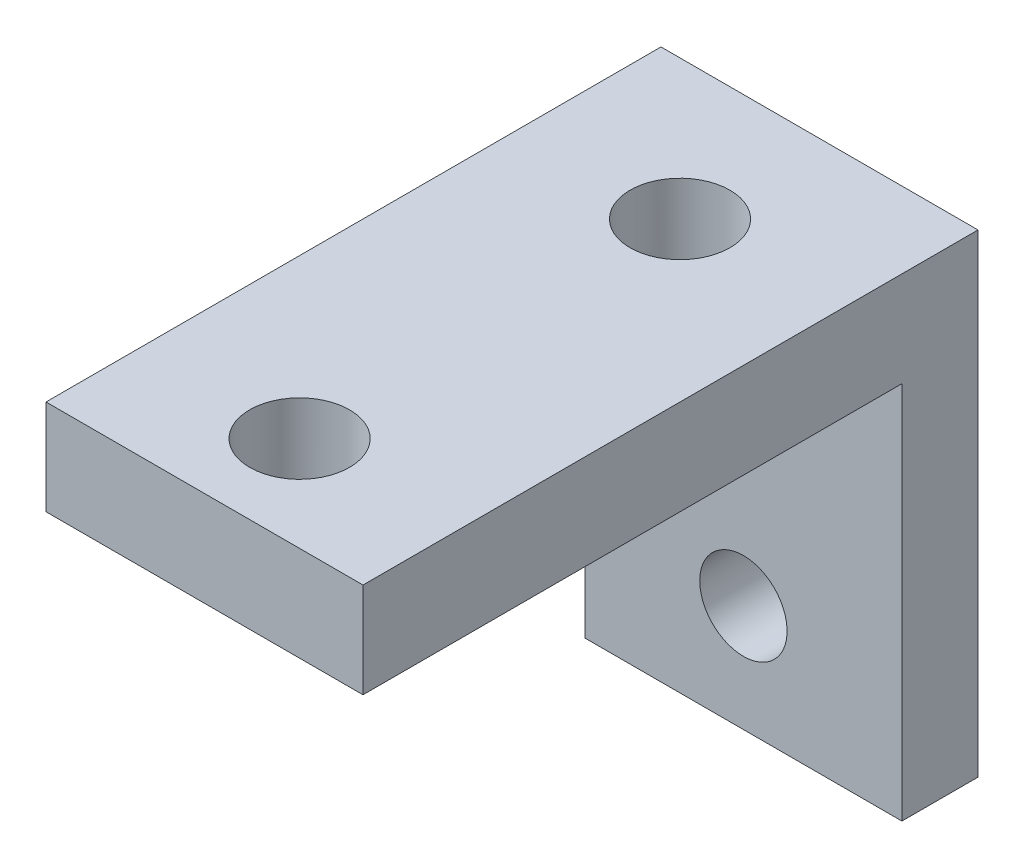
ISO-10303-21;
HEADER;
FILE_DESCRIPTION(('STEP AP214'),'2;1');
FILE_NAME('part.step','',(''),(''),'','','');
FILE_SCHEMA(('AUTOMOTIVE_DESIGN { 1 0 10303 214 1 1 1 1 }'));
ENDSEC;
DATA;
#1=APPLICATION_CONTEXT('core data for automotive mechanical design processes');
#2=APPLICATION_PROTOCOL_DEFINITION('international standard','automotive_design',2000,#1);
#3=PRODUCT_CONTEXT('',#1,'mechanical');
#4=PRODUCT('Part','Part','',(#3));
#5=PRODUCT_RELATED_PRODUCT_CATEGORY('part','',(#4));
#6=PRODUCT_DEFINITION_FORMATION('','',#4);
#7=PRODUCT_DEFINITION_CONTEXT('part definition',#1,'design');
#8=PRODUCT_DEFINITION('design','',#6,#7);
#9=PRODUCT_DEFINITION_SHAPE('','',#8);
#10=(LENGTH_UNIT() NAMED_UNIT(*) SI_UNIT(.MILLI.,.METRE.));
#11=(NAMED_UNIT(*) PLANE_ANGLE_UNIT() SI_UNIT($,.RADIAN.));
#12=(NAMED_UNIT(*) SI_UNIT($,.STERADIAN.) SOLID_ANGLE_UNIT());
#13=UNCERTAINTY_MEASURE_WITH_UNIT(LENGTH_MEASURE(1.E-05),#10,'distance_accuracy_value','');
#14=(GEOMETRIC_REPRESENTATION_CONTEXT(3) GLOBAL_UNCERTAINTY_ASSIGNED_CONTEXT((#13)) GLOBAL_UNIT_ASSIGNED_CONTEXT((#10,
#11,#12)) REPRESENTATION_CONTEXT('',''));
#15=CARTESIAN_POINT('',(0.,0.,0.));
#16=DIRECTION('',(0.,0.,1.));
#17=DIRECTION('',(1.,0.,0.));
#18=AXIS2_PLACEMENT_3D('',#15,#16,#17);
#19=CARTESIAN_POINT('',(0.,0.,3.048));
#20=DIRECTION('',(0.,0.,-1.));
#21=DIRECTION('',(-1.,0.,0.));
#22=AXIS2_PLACEMENT_3D('',#19,#20,#21);
#23=PLANE('',#22);
#24=CARTESIAN_POINT('',(0.,-5.203000064,3.048));
#25=DIRECTION('',(0.,0.,1.));
#26=DIRECTION('',(1.,0.,0.));
#27=AXIS2_PLACEMENT_3D('',#24,#25,#26);
#28=CIRCLE('',#27,1.75);
#29=CARTESIAN_POINT('',(-1.75,-5.203000064,3.048));
#30=VERTEX_POINT('',#29);
#31=EDGE_CURVE('E103',#30,#30,#28,.T.);
#32=ORIENTED_EDGE('',*,*,#31,.F.);
#33=EDGE_LOOP('',(#32));
#34=FACE_BOUND('',#33,.T.);
#35=DIRECTION('',(1.,0.,0.));
#36=VECTOR('',#35,1.);
#37=CARTESIAN_POINT('',(-6.35,5.683000064,3.048));
#38=LINE('',#37,#36);
#39=CARTESIAN_POINT('',(-6.35,5.683000064,3.048));
#40=VERTEX_POINT('',#39);
#41=CARTESIAN_POINT('',(6.35,5.683000064,3.048));
#42=VERTEX_POINT('',#41);
#43=EDGE_CURVE('E56',#40,#42,#38,.T.);
#44=ORIENTED_EDGE('',*,*,#43,.F.);
#45=DIRECTION('',(0.,-1.,0.));
#46=VECTOR('',#45,1.);
#47=CARTESIAN_POINT('',(-6.34999999999999,-9.493000064,3.048));
#48=LINE('',#47,#46);
#49=CARTESIAN_POINT('',(-6.34999999999999,-9.493000064,3.048));
#50=VERTEX_POINT('',#49);
#51=EDGE_CURVE('E149',#40,#50,#48,.T.);
#52=ORIENTED_EDGE('',*,*,#51,.T.);
#53=DIRECTION('',(1.,0.,0.));
#54=VECTOR('',#53,1.);
#55=CARTESIAN_POINT('',(-6.34999999999999,-9.493000064,3.048));
#56=LINE('',#55,#54);
#57=CARTESIAN_POINT('',(6.35,-9.493000064,3.048));
#58=VERTEX_POINT('',#57);
#59=EDGE_CURVE('E62',#50,#58,#56,.T.);
#60=ORIENTED_EDGE('',*,*,#59,.T.);
#61=DIRECTION('',(0.,1.,0.));
#62=VECTOR('',#61,1.);
#63=CARTESIAN_POINT('',(6.35,-9.493000064,3.048));
#64=LINE('',#63,#62);
#65=EDGE_CURVE('E91',#58,#42,#64,.T.);
#66=ORIENTED_EDGE('',*,*,#65,.T.);
#67=EDGE_LOOP('',(#44,#52,#60,#66));
#68=FACE_BOUND('',#67,.T.);
#69=ADVANCED_FACE('F39',(#34,#68),#23,.F.);
#70=CARTESIAN_POINT('',(0.,0.,0.));
#71=DIRECTION('',(0.,0.,-1.));
#72=DIRECTION('',(-1.,0.,0.));
#73=AXIS2_PLACEMENT_3D('',#70,#71,#72);
#74=PLANE('',#73);
#75=DIRECTION('',(0.,1.,0.));
#76=VECTOR('',#75,1.);
#77=CARTESIAN_POINT('',(6.35,-9.493000064,0.));
#78=LINE('',#77,#76);
#79=CARTESIAN_POINT('',(6.35,-9.493000064,0.));
#80=VERTEX_POINT('',#79);
#81=CARTESIAN_POINT('',(6.35,9.493000064,0.));
#82=VERTEX_POINT('',#81);
#83=EDGE_CURVE('E97',#80,#82,#78,.T.);
#84=ORIENTED_EDGE('',*,*,#83,.F.);
#85=DIRECTION('',(1.,0.,0.));
#86=VECTOR('',#85,1.);
#87=CARTESIAN_POINT('',(-6.34999999999999,-9.493000064,0.));
#88=LINE('',#87,#86);
#89=CARTESIAN_POINT('',(-6.34999999999999,-9.493000064,0.));
#90=VERTEX_POINT('',#89);
#91=EDGE_CURVE('E81',#90,#80,#88,.T.);
#92=ORIENTED_EDGE('',*,*,#91,.F.);
#93=DIRECTION('',(0.,-1.,0.));
#94=VECTOR('',#93,1.);
#95=CARTESIAN_POINT('',(-6.34999999999999,-9.493000064,0.));
#96=LINE('',#95,#94);
#97=CARTESIAN_POINT('',(-6.35,9.493000064,0.));
#98=VERTEX_POINT('',#97);
#99=EDGE_CURVE('E92',#98,#90,#96,.T.);
#100=ORIENTED_EDGE('',*,*,#99,.F.);
#101=DIRECTION('',(-1.,0.,0.));
#102=VECTOR('',#101,1.);
#103=CARTESIAN_POINT('',(-6.35,9.493000064,0.));
#104=LINE('',#103,#102);
#105=EDGE_CURVE('E102',#82,#98,#104,.T.);
#106=ORIENTED_EDGE('',*,*,#105,.F.);
#107=EDGE_LOOP('',(#84,#92,#100,#106));
#108=FACE_BOUND('',#107,.T.);
#109=CARTESIAN_POINT('',(0.,-5.203000064,0.));
#110=DIRECTION('',(0.,0.,1.));
#111=DIRECTION('',(1.,0.,0.));
#112=AXIS2_PLACEMENT_3D('',#109,#110,#111);
#113=CIRCLE('',#112,1.75);
#114=CARTESIAN_POINT('',(-1.75,-5.203000064,0.));
#115=VERTEX_POINT('',#114);
#116=EDGE_CURVE('E107',#115,#115,#113,.T.);
#117=ORIENTED_EDGE('',*,*,#116,.T.);
#118=EDGE_LOOP('',(#117));
#119=FACE_BOUND('',#118,.T.);
#120=ADVANCED_FACE('F100',(#108,#119),#74,.T.);
#121=CARTESIAN_POINT('',(6.35,-9.493000064,3.048));
#122=DIRECTION('',(-1.,0.,0.));
#123=DIRECTION('',(0.,-1.,0.));
#124=AXIS2_PLACEMENT_3D('',#121,#122,#123);
#125=PLANE('',#124);
#126=ORIENTED_EDGE('',*,*,#83,.T.);
#127=DIRECTION('',(0.,0.,-1.));
#128=VECTOR('',#127,1.);
#129=CARTESIAN_POINT('',(6.35,9.493000064,3.048));
#130=LINE('',#129,#128);
#131=CARTESIAN_POINT('',(6.35,9.493000064,24.638));
#132=VERTEX_POINT('',#131);
#133=EDGE_CURVE('E11',#132,#82,#130,.T.);
#134=ORIENTED_EDGE('',*,*,#133,.F.);
#135=DIRECTION('',(0.,-1.,0.));
#136=VECTOR('',#135,1.);
#137=CARTESIAN_POINT('',(6.35,9.493000064,24.638));
#138=LINE('',#137,#136);
#139=CARTESIAN_POINT('',(6.35,5.683000064,24.638));
#140=VERTEX_POINT('',#139);
#141=EDGE_CURVE('E121',#132,#140,#138,.T.);
#142=ORIENTED_EDGE('',*,*,#141,.T.);
#143=DIRECTION('',(0.,0.,-1.));
#144=VECTOR('',#143,1.);
#145=CARTESIAN_POINT('',(6.35,5.683000064,3.048));
#146=LINE('',#145,#144);
#147=EDGE_CURVE('E134',#140,#42,#146,.T.);
#148=ORIENTED_EDGE('',*,*,#147,.T.);
#149=ORIENTED_EDGE('',*,*,#65,.F.);
#150=DIRECTION('',(0.,0.,-1.));
#151=VECTOR('',#150,1.);
#152=CARTESIAN_POINT('',(6.35,-9.493000064,3.048));
#153=LINE('',#152,#151);
#154=EDGE_CURVE('E84',#58,#80,#153,.T.);
#155=ORIENTED_EDGE('',*,*,#154,.T.);
#156=EDGE_LOOP('',(#126,#134,#142,#148,#149,#155));
#157=FACE_BOUND('',#156,.T.);
#158=ADVANCED_FACE('F41',(#157),#125,.F.);
#159=CARTESIAN_POINT('',(-6.35,9.493000064,3.048));
#160=DIRECTION('',(0.,-1.,0.));
#161=DIRECTION('',(0.,0.,-1.));
#162=AXIS2_PLACEMENT_3D('',#159,#160,#161);
#163=PLANE('',#162);
#164=CARTESIAN_POINT('',(0.,9.493000064,20.828));
#165=DIRECTION('',(0.,1.,0.));
#166=DIRECTION('',(0.,0.,1.));
#167=AXIS2_PLACEMENT_3D('',#164,#165,#166);
#168=CIRCLE('',#167,2.);
#169=CARTESIAN_POINT('',(0.,9.493000064,22.828));
#170=VERTEX_POINT('',#169);
#171=EDGE_CURVE('E117',#170,#170,#168,.T.);
#172=ORIENTED_EDGE('',*,*,#171,.F.);
#173=EDGE_LOOP('',(#172));
#174=FACE_BOUND('',#173,.T.);
#175=CARTESIAN_POINT('',(0.,9.493000064,5.588));
#176=DIRECTION('',(0.,1.,0.));
#177=DIRECTION('',(0.,0.,-1.));
#178=AXIS2_PLACEMENT_3D('',#175,#176,#177);
#179=CIRCLE('',#178,2.);
#180=CARTESIAN_POINT('',(0.,9.493000064,3.588));
#181=VERTEX_POINT('',#180);
#182=EDGE_CURVE('E123',#181,#181,#179,.T.);
#183=ORIENTED_EDGE('',*,*,#182,.F.);
#184=EDGE_LOOP('',(#183));
#185=FACE_BOUND('',#184,.T.);
#186=ORIENTED_EDGE('',*,*,#105,.T.);
#187=DIRECTION('',(0.,0.,-1.));
#188=VECTOR('',#187,1.);
#189=CARTESIAN_POINT('',(-6.35,9.493000064,3.048));
#190=LINE('',#189,#188);
#191=CARTESIAN_POINT('',(-6.35,9.493000064,24.638));
#192=VERTEX_POINT('',#191);
#193=EDGE_CURVE('E48',#192,#98,#190,.T.);
#194=ORIENTED_EDGE('',*,*,#193,.F.);
#195=DIRECTION('',(1.,0.,0.));
#196=VECTOR('',#195,1.);
#197=CARTESIAN_POINT('',(-6.35,9.493000064,24.638));
#198=LINE('',#197,#196);
#199=EDGE_CURVE('E137',#192,#132,#198,.T.);
#200=ORIENTED_EDGE('',*,*,#199,.T.);
#201=ORIENTED_EDGE('',*,*,#133,.T.);
#202=EDGE_LOOP('',(#186,#194,#200,#201));
#203=FACE_BOUND('',#202,.T.);
#204=ADVANCED_FACE('F158',(#174,#185,#203),#163,.F.);
#205=CARTESIAN_POINT('',(-6.34999999999999,-9.493000064,3.048));
#206=DIRECTION('',(1.,0.,0.));
#207=DIRECTION('',(0.,1.,0.));
#208=AXIS2_PLACEMENT_3D('',#205,#206,#207);
#209=PLANE('',#208);
#210=ORIENTED_EDGE('',*,*,#99,.T.);
#211=DIRECTION('',(0.,0.,-1.));
#212=VECTOR('',#211,1.);
#213=CARTESIAN_POINT('',(-6.34999999999999,-9.493000064,3.048));
#214=LINE('',#213,#212);
#215=EDGE_CURVE('E87',#50,#90,#214,.T.);
#216=ORIENTED_EDGE('',*,*,#215,.F.);
#217=ORIENTED_EDGE('',*,*,#51,.F.);
#218=DIRECTION('',(0.,0.,-1.));
#219=VECTOR('',#218,1.);
#220=CARTESIAN_POINT('',(-6.35,5.683000064,3.048));
#221=LINE('',#220,#219);
#222=CARTESIAN_POINT('',(-6.35,5.683000064,24.638));
#223=VERTEX_POINT('',#222);
#224=EDGE_CURVE('E133',#223,#40,#221,.T.);
#225=ORIENTED_EDGE('',*,*,#224,.F.);
#226=DIRECTION('',(0.,-1.,0.));
#227=VECTOR('',#226,1.);
#228=CARTESIAN_POINT('',(-6.35,9.493000064,24.638));
#229=LINE('',#228,#227);
#230=EDGE_CURVE('E130',#192,#223,#229,.T.);
#231=ORIENTED_EDGE('',*,*,#230,.F.);
#232=ORIENTED_EDGE('',*,*,#193,.T.);
#233=EDGE_LOOP('',(#210,#216,#217,#225,#231,#232));
#234=FACE_BOUND('',#233,.T.);
#235=ADVANCED_FACE('F152',(#234),#209,.F.);
#236=CARTESIAN_POINT('',(-6.34999999999999,-9.493000064,3.048));
#237=DIRECTION('',(0.,1.,0.));
#238=DIRECTION('',(-1.,0.,0.));
#239=AXIS2_PLACEMENT_3D('',#236,#237,#238);
#240=PLANE('',#239);
#241=ORIENTED_EDGE('',*,*,#91,.T.);
#242=ORIENTED_EDGE('',*,*,#154,.F.);
#243=ORIENTED_EDGE('',*,*,#59,.F.);
#244=ORIENTED_EDGE('',*,*,#215,.T.);
#245=EDGE_LOOP('',(#241,#242,#243,#244));
#246=FACE_BOUND('',#245,.T.);
#247=ADVANCED_FACE('F83',(#246),#240,.F.);
#248=CARTESIAN_POINT('',(0.,-5.203000064,3.048));
#249=DIRECTION('',(0.,0.,-1.));
#250=DIRECTION('',(-1.,0.,0.));
#251=AXIS2_PLACEMENT_3D('',#248,#249,#250);
#252=CYLINDRICAL_SURFACE('',#251,1.75);
#253=CARTESIAN_POINT('',(-1.75,-5.203000064,3.048));
#254=CARTESIAN_POINT('',(-1.75,-5.203000064,3.01625));
#255=CARTESIAN_POINT('',(-1.75,-5.203000064,2.9845));
#256=CARTESIAN_POINT('',(-1.75,-5.203000064,2.921));
#257=CARTESIAN_POINT('',(-1.75,-5.203000064,2.88925));
#258=CARTESIAN_POINT('',(-1.75,-5.203000064,2.82575));
#259=CARTESIAN_POINT('',(-1.75,-5.203000064,2.794));
#260=CARTESIAN_POINT('',(-1.75,-5.203000064,2.7305));
#261=CARTESIAN_POINT('',(-1.75,-5.203000064,2.69875));
#262=CARTESIAN_POINT('',(-1.75,-5.203000064,2.63525));
#263=CARTESIAN_POINT('',(-1.75,-5.203000064,2.6035));
#264=CARTESIAN_POINT('',(-1.75,-5.203000064,2.54));
#265=CARTESIAN_POINT('',(-1.75,-5.203000064,2.50825));
#266=CARTESIAN_POINT('',(-1.75,-5.203000064,2.44475));
#267=CARTESIAN_POINT('',(-1.75,-5.203000064,2.413));
#268=CARTESIAN_POINT('',(-1.75,-5.203000064,2.3495));
#269=CARTESIAN_POINT('',(-1.75,-5.203000064,2.31775));
#270=CARTESIAN_POINT('',(-1.75,-5.203000064,2.25425));
#271=CARTESIAN_POINT('',(-1.75,-5.203000064,2.2225));
#272=CARTESIAN_POINT('',(-1.75,-5.203000064,2.159));
#273=CARTESIAN_POINT('',(-1.75,-5.203000064,2.12725));
#274=CARTESIAN_POINT('',(-1.75,-5.203000064,2.06375));
#275=CARTESIAN_POINT('',(-1.75,-5.203000064,2.032));
#276=CARTESIAN_POINT('',(-1.75,-5.203000064,1.9685));
#277=CARTESIAN_POINT('',(-1.75,-5.203000064,1.93675));
#278=CARTESIAN_POINT('',(-1.75,-5.203000064,1.87325));
#279=CARTESIAN_POINT('',(-1.75,-5.203000064,1.8415));
#280=CARTESIAN_POINT('',(-1.75,-5.203000064,1.778));
#281=CARTESIAN_POINT('',(-1.75,-5.203000064,1.74625));
#282=CARTESIAN_POINT('',(-1.75,-5.203000064,1.68275));
#283=CARTESIAN_POINT('',(-1.75,-5.203000064,1.651));
#284=CARTESIAN_POINT('',(-1.75,-5.203000064,1.5875));
#285=CARTESIAN_POINT('',(-1.75,-5.203000064,1.55575));
#286=CARTESIAN_POINT('',(-1.75,-5.203000064,1.49225));
#287=CARTESIAN_POINT('',(-1.75,-5.203000064,1.4605));
#288=CARTESIAN_POINT('',(-1.75,-5.203000064,1.397));
#289=CARTESIAN_POINT('',(-1.75,-5.203000064,1.36525));
#290=CARTESIAN_POINT('',(-1.75,-5.203000064,1.30175));
#291=CARTESIAN_POINT('',(-1.75,-5.203000064,1.27));
#292=CARTESIAN_POINT('',(-1.75,-5.203000064,1.2065));
#293=CARTESIAN_POINT('',(-1.75,-5.203000064,1.17475));
#294=CARTESIAN_POINT('',(-1.75,-5.203000064,1.11125));
#295=CARTESIAN_POINT('',(-1.75,-5.203000064,1.0795));
#296=CARTESIAN_POINT('',(-1.75,-5.203000064,1.016));
#297=CARTESIAN_POINT('',(-1.75,-5.203000064,0.98425));
#298=CARTESIAN_POINT('',(-1.75,-5.203000064,0.92075));
#299=CARTESIAN_POINT('',(-1.75,-5.203000064,0.889));
#300=CARTESIAN_POINT('',(-1.75,-5.203000064,0.8255));
#301=CARTESIAN_POINT('',(-1.75,-5.203000064,0.79375));
#302=CARTESIAN_POINT('',(-1.75,-5.203000064,0.73025));
#303=CARTESIAN_POINT('',(-1.75,-5.203000064,0.6985));
#304=CARTESIAN_POINT('',(-1.75,-5.203000064,0.635));
#305=CARTESIAN_POINT('',(-1.75,-5.203000064,0.60325));
#306=CARTESIAN_POINT('',(-1.75,-5.203000064,0.53975));
#307=CARTESIAN_POINT('',(-1.75,-5.203000064,0.508));
#308=CARTESIAN_POINT('',(-1.75,-5.203000064,0.4445));
#309=CARTESIAN_POINT('',(-1.75,-5.203000064,0.41275));
#310=CARTESIAN_POINT('',(-1.75,-5.203000064,0.34925));
#311=CARTESIAN_POINT('',(-1.75,-5.203000064,0.3175));
#312=CARTESIAN_POINT('',(-1.75,-5.203000064,0.254));
#313=CARTESIAN_POINT('',(-1.75,-5.203000064,0.22225));
#314=CARTESIAN_POINT('',(-1.75,-5.203000064,0.15875));
#315=CARTESIAN_POINT('',(-1.75,-5.203000064,0.127));
#316=CARTESIAN_POINT('',(-1.75,-5.203000064,0.0634999999999999));
#317=CARTESIAN_POINT('',(-1.75,-5.203000064,0.03175));
#318=CARTESIAN_POINT('',(-1.75,-5.203000064,0.));
#319=B_SPLINE_CURVE_WITH_KNOTS('',3,(#253,#254,#255,#256,#257,#258,#259,#260,#261,#262,#263,
#264,#265,#266,#267,#268,#269,#270,#271,#272,#273,#274,#275,#276,#277,#278,#279,#280,#281,#282,
#283,#284,#285,#286,#287,#288,#289,#290,#291,#292,#293,#294,#295,#296,#297,#298,#299,#300,#301,
#302,#303,#304,#305,#306,#307,#308,#309,#310,#311,#312,#313,#314,#315,#316,#317,#318),
.UNSPECIFIED.,.F.,.F.,(4,2,2,2,2,2,2,2,2,2,2,2,2,2,2,2,2,2,2,2,2,2,2,2,2,2,2,2,2,2,2,2,4),(0.,
0.0952500000000003,0.1905,0.28575,0.381,0.47625,0.5715,0.66675,0.762,0.85725,0.9525,1.04775,
1.143,1.23825,1.3335,1.42875,1.524,1.61925,1.7145,1.80975,1.905,2.00025,2.0955,2.19075,2.286,
2.38125,2.4765,2.57175,2.667,2.76225,2.8575,2.95275,3.048),.UNSPECIFIED.);
#320=EDGE_CURVE('BSEAM174',#30,#115,#319,.T.);
#321=ORIENTED_EDGE('',*,*,#31,.T.);
#322=ORIENTED_EDGE('',*,*,#116,.F.);
#323=ORIENTED_EDGE('',*,*,#320,.T.);
#324=ORIENTED_EDGE('',*,*,#320,.F.);
#325=EDGE_LOOP('',(#321,#323,#322,#324));
#326=FACE_BOUND('',#325,.T.);
#327=ADVANCED_FACE('F174',(#326),#252,.F.);
#328=CARTESIAN_POINT('',(-6.35,5.683000064,3.048));
#329=DIRECTION('',(0.,-1.,0.));
#330=DIRECTION('',(1.,0.,0.));
#331=AXIS2_PLACEMENT_3D('',#328,#329,#330);
#332=PLANE('',#331);
#333=CARTESIAN_POINT('',(0.,5.683000064,20.828));
#334=DIRECTION('',(0.,-1.,0.));
#335=DIRECTION('',(1.,0.,0.));
#336=AXIS2_PLACEMENT_3D('',#333,#334,#335);
#337=CIRCLE('',#336,2.);
#338=CARTESIAN_POINT('',(2.00000000000001,5.683000064,20.828));
#339=VERTEX_POINT('',#338);
#340=EDGE_CURVE('E43',#339,#339,#337,.T.);
#341=ORIENTED_EDGE('',*,*,#340,.F.);
#342=EDGE_LOOP('',(#341));
#343=FACE_BOUND('',#342,.T.);
#344=CARTESIAN_POINT('',(0.,5.683000064,5.588));
#345=DIRECTION('',(0.,-1.,0.));
#346=DIRECTION('',(1.,0.,0.));
#347=AXIS2_PLACEMENT_3D('',#344,#345,#346);
#348=CIRCLE('',#347,2.);
#349=CARTESIAN_POINT('',(2.,5.683000064,5.588));
#350=VERTEX_POINT('',#349);
#351=EDGE_CURVE('E115',#350,#350,#348,.T.);
#352=ORIENTED_EDGE('',*,*,#351,.F.);
#353=EDGE_LOOP('',(#352));
#354=FACE_BOUND('',#353,.T.);
#355=ORIENTED_EDGE('',*,*,#147,.F.);
#356=DIRECTION('',(1.,0.,0.));
#357=VECTOR('',#356,1.);
#358=CARTESIAN_POINT('',(-6.35,5.683000064,24.638));
#359=LINE('',#358,#357);
#360=EDGE_CURVE('E142',#223,#140,#359,.T.);
#361=ORIENTED_EDGE('',*,*,#360,.F.);
#362=ORIENTED_EDGE('',*,*,#224,.T.);
#363=ORIENTED_EDGE('',*,*,#43,.T.);
#364=EDGE_LOOP('',(#355,#361,#362,#363));
#365=FACE_BOUND('',#364,.T.);
#366=ADVANCED_FACE('F171',(#343,#354,#365),#332,.T.);
#367=CARTESIAN_POINT('',(-6.35,9.493000064,24.638));
#368=DIRECTION('',(0.,0.,1.));
#369=DIRECTION('',(0.,-1.,0.));
#370=AXIS2_PLACEMENT_3D('',#367,#368,#369);
#371=PLANE('',#370);
#372=ORIENTED_EDGE('',*,*,#141,.F.);
#373=ORIENTED_EDGE('',*,*,#199,.F.);
#374=ORIENTED_EDGE('',*,*,#230,.T.);
#375=ORIENTED_EDGE('',*,*,#360,.T.);
#376=EDGE_LOOP('',(#372,#373,#374,#375));
#377=FACE_BOUND('',#376,.T.);
#378=ADVANCED_FACE('F164',(#377),#371,.T.);
#379=CARTESIAN_POINT('',(0.,-9.493000064,5.588));
#380=DIRECTION('',(0.,1.,0.));
#381=DIRECTION('',(0.,0.,1.));
#382=AXIS2_PLACEMENT_3D('',#379,#380,#381);
#383=CYLINDRICAL_SURFACE('',#382,2.);
#384=ORIENTED_EDGE('',*,*,#351,.T.);
#385=EDGE_LOOP('',(#384));
#386=FACE_BOUND('',#385,.T.);
#387=ORIENTED_EDGE('',*,*,#182,.T.);
#388=EDGE_LOOP('',(#387));
#389=FACE_BOUND('',#388,.T.);
#390=ADVANCED_FACE('F182',(#386,#389),#383,.F.);
#391=CARTESIAN_POINT('',(0.,-9.493000064,20.828));
#392=DIRECTION('',(0.,1.,0.));
#393=DIRECTION('',(0.,0.,1.));
#394=AXIS2_PLACEMENT_3D('',#391,#392,#393);
#395=CYLINDRICAL_SURFACE('',#394,2.);
#396=ORIENTED_EDGE('',*,*,#340,.T.);
#397=EDGE_LOOP('',(#396));
#398=FACE_BOUND('',#397,.T.);
#399=ORIENTED_EDGE('',*,*,#171,.T.);
#400=EDGE_LOOP('',(#399));
#401=FACE_BOUND('',#400,.T.);
#402=ADVANCED_FACE('F209',(#398,#401),#395,.F.);
#403=CLOSED_SHELL('',(#69,#120,#158,#204,#235,#247,#327,#366,#378,#390,#402));
#404=MANIFOLD_SOLID_BREP('B2',#403);
#405=ADVANCED_BREP_SHAPE_REPRESENTATION('',(#18,#404),#14);
#406=SHAPE_DEFINITION_REPRESENTATION(#9,#405);
ENDSEC;
END-ISO-10303-21;
